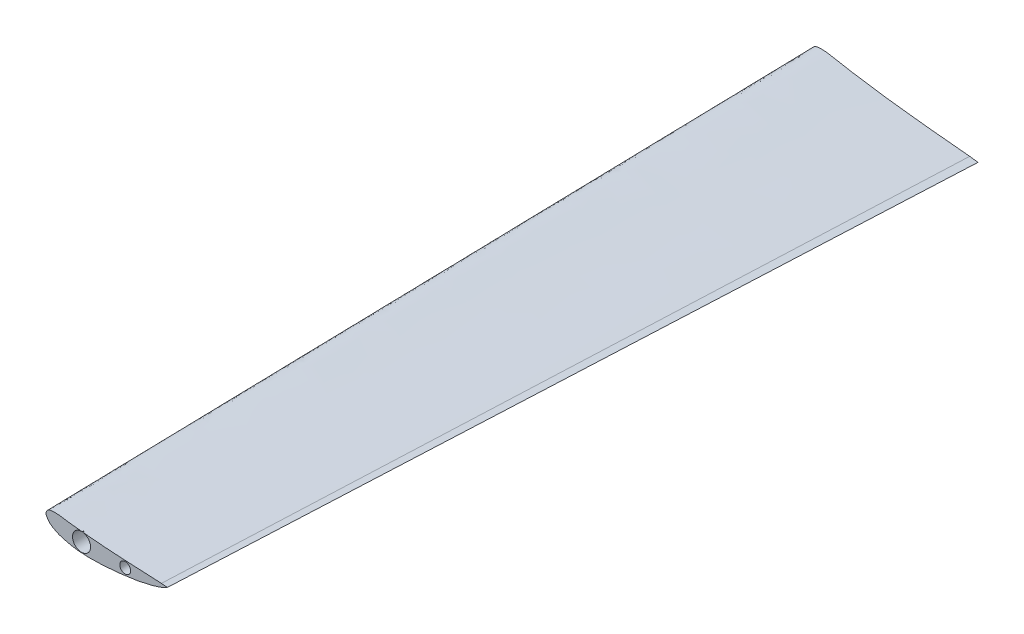
ISO-10303-21;
HEADER;
FILE_DESCRIPTION(('STEP AP214'),'2;1');
FILE_NAME('part.step','',(''),(''),'','','');
FILE_SCHEMA(('AUTOMOTIVE_DESIGN { 1 0 10303 214 1 1 1 1 }'));
ENDSEC;
DATA;
#1=APPLICATION_CONTEXT('core data for automotive mechanical design processes');
#2=APPLICATION_PROTOCOL_DEFINITION('international standard','automotive_design',2000,#1);
#3=PRODUCT_CONTEXT('',#1,'mechanical');
#4=PRODUCT('Part','Part','',(#3));
#5=PRODUCT_RELATED_PRODUCT_CATEGORY('part','',(#4));
#6=PRODUCT_DEFINITION_FORMATION('','',#4);
#7=PRODUCT_DEFINITION_CONTEXT('part definition',#1,'design');
#8=PRODUCT_DEFINITION('design','',#6,#7);
#9=PRODUCT_DEFINITION_SHAPE('','',#8);
#10=(LENGTH_UNIT() NAMED_UNIT(*) SI_UNIT(.MILLI.,.METRE.));
#11=(NAMED_UNIT(*) PLANE_ANGLE_UNIT() SI_UNIT($,.RADIAN.));
#12=(NAMED_UNIT(*) SI_UNIT($,.STERADIAN.) SOLID_ANGLE_UNIT());
#13=UNCERTAINTY_MEASURE_WITH_UNIT(LENGTH_MEASURE(1.E-05),#10,'distance_accuracy_value','');
#14=(GEOMETRIC_REPRESENTATION_CONTEXT(3) GLOBAL_UNCERTAINTY_ASSIGNED_CONTEXT((#13)) GLOBAL_UNIT_ASSIGNED_CONTEXT((#10,
#11,#12)) REPRESENTATION_CONTEXT('',''));
#15=CARTESIAN_POINT('',(0.,0.,0.));
#16=DIRECTION('',(0.,0.,1.));
#17=DIRECTION('',(1.,0.,0.));
#18=AXIS2_PLACEMENT_3D('',#15,#16,#17);
#19=CARTESIAN_POINT('',(-12.5819997362755,1.44490278911865,-215.));
#20=DIRECTION('',(0.,0.,1.));
#21=DIRECTION('',(1.,0.,0.));
#22=AXIS2_PLACEMENT_3D('',#19,#20,#21);
#23=PLANE('',#22);
#24=CARTESIAN_POINT('',(12.063322186895,-0.172116284613179,-215.));
#25=DIRECTION('',(0.,0.,1.));
#26=DIRECTION('',(1.,0.,0.));
#27=AXIS2_PLACEMENT_3D('',#24,#25,#26);
#28=CIRCLE('',#27,1.5);
#29=CARTESIAN_POINT('',(13.563322186895,-0.172116284613179,-215.));
#30=VERTEX_POINT('',#29);
#31=EDGE_CURVE('E121',#30,#30,#28,.T.);
#32=ORIENTED_EDGE('',*,*,#31,.T.);
#33=EDGE_LOOP('',(#32));
#34=FACE_BOUND('',#33,.T.);
#35=CARTESIAN_POINT('',(0.,0.,-215.));
#36=DIRECTION('',(0.,0.,1.));
#37=DIRECTION('',(1.,0.,0.));
#38=AXIS2_PLACEMENT_3D('',#35,#36,#37);
#39=CIRCLE('',#38,2.5);
#40=CARTESIAN_POINT('',(2.5,0.,-215.));
#41=VERTEX_POINT('',#40);
#42=EDGE_CURVE('E84',#41,#41,#39,.T.);
#43=ORIENTED_EDGE('',*,*,#42,.T.);
#44=EDGE_LOOP('',(#43));
#45=FACE_BOUND('',#44,.T.);
#46=CARTESIAN_POINT('',(30.4113785621477,-0.0484002442627476,-215.));
#47=CARTESIAN_POINT('',(29.6454694877873,0.026566871565662,-215.));
#48=CARTESIAN_POINT('',(27.3477422647068,0.251468219050302,-215.));
#49=CARTESIAN_POINT('',(23.5189856354564,0.633666696272388,-215.));
#50=CARTESIAN_POINT('',(18.9212057833677,1.05691563565401,-215.));
#51=CARTESIAN_POINT('',(14.3378164362077,1.60965355839776,-215.));
#52=CARTESIAN_POINT('',(9.74673995821571,2.09062433500616,-215.));
#53=CARTESIAN_POINT('',(5.17509493438157,2.72885063741591,-215.));
#54=CARTESIAN_POINT('',(0.60167993974661,3.36062908634859,-215.));
#55=CARTESIAN_POINT('',(-3.19166320344617,4.00741358924806,-215.));
#56=CARTESIAN_POINT('',(-6.23140034199928,4.5128685145492,-215.));
#57=CARTESIAN_POINT('',(-8.10480601021255,4.97070206772562,-215.));
#58=CARTESIAN_POINT('',(-9.6435286668681,5.134562868883,-215.));
#59=CARTESIAN_POINT('',(-10.8052865093902,5.16710523802775,-215.));
#60=CARTESIAN_POINT('',(-11.8533241938368,5.1160194218416,-215.));
#61=CARTESIAN_POINT('',(-12.8545459614183,4.57851263632639,-215.));
#62=CARTESIAN_POINT('',(-13.6239443974408,3.4061895897156,-215.));
#63=CARTESIAN_POINT('',(-13.0093761995299,2.17115138802204,-215.));
#64=CARTESIAN_POINT('',(-12.3983110532503,1.08953086614345,-215.));
#65=CARTESIAN_POINT('',(-11.4952204988513,0.229604254835794,-215.));
#66=CARTESIAN_POINT('',(-10.3842737514795,-0.511205932124786,-215.));
#67=CARTESIAN_POINT('',(-8.96546395144117,-1.35652737302625,-215.));
#68=CARTESIAN_POINT('',(-7.09095487017499,-2.06430188624797,-215.));
#69=CARTESIAN_POINT('',(-4.12337213787246,-3.02777084468667,-215.));
#70=CARTESIAN_POINT('',(-0.300492468612642,-3.68923892534138,-215.));
#71=CARTESIAN_POINT('',(4.31749802810697,-4.06348304674317,-215.));
#72=CARTESIAN_POINT('',(8.96994319746569,-4.06972331148482,-215.));
#73=CARTESIAN_POINT('',(13.6447489370111,-3.89627252679786,-215.));
#74=CARTESIAN_POINT('',(18.3482661610054,-3.5773782916158,-215.));
#75=CARTESIAN_POINT('',(23.0987876160855,-3.04952608629674,-215.));
#76=CARTESIAN_POINT('',(27.0628881136656,-2.27096966882288,-215.));
#77=CARTESIAN_POINT('',(30.3218247503512,-1.45813343814418,-215.));
#78=CARTESIAN_POINT('',(31.8897041320066,-0.722475780532528,-215.));
#79=CARTESIAN_POINT('',(32.7002748517004,-0.34215152602974,-215.));
#80=B_SPLINE_CURVE_WITH_KNOTS('',3,(#46,#47,#48,#49,#50,#51,#52,#53,#54,#55,#56,#57,#58,#59,#60,
#61,#62,#63,#64,#65,#66,#67,#68,#69,#70,#71,#72,#73,#74,#75,#76,#77,#78,#79),.UNSPECIFIED.,.F.,
.F.,(4,1,1,1,1,1,1,1,1,1,1,1,1,1,1,1,1,1,1,1,1,1,1,1,1,1,1,1,1,1,1,4),(0.,0.024539223239315,
0.0736176697179449,0.122696116196575,0.171758102468826,0.220820088741077,0.269879113320182,
0.318936693489756,0.368025361597795,0.392583028094628,0.417173001250673,0.429440472758663,
0.441764658743505,0.454461371263475,0.461994015532278,0.477712656864197,0.492780517083889,
0.502278122505289,0.517831839222446,0.531656069899839,0.544957030128068,0.57036121074101,
0.595284183630096,0.644429948946362,0.693535769444944,0.742943262592495,0.792666042354747,
0.842690657547491,0.893260265870848,0.94491578158227,0.971522264346957,1.),.UNSPECIFIED.);
#81=CARTESIAN_POINT('',(30.4113785621477,-0.0484002442627476,-215.));
#82=VERTEX_POINT('',#81);
#83=CARTESIAN_POINT('',(32.7002748517004,-0.34215152602974,-215.));
#84=VERTEX_POINT('',#83);
#85=EDGE_CURVE('E72',#82,#84,#80,.T.);
#86=ORIENTED_EDGE('',*,*,#85,.F.);
#87=DIRECTION('',(-0.991865092818963,0.127293509839388,0.));
#88=VECTOR('',#87,1.);
#89=CARTESIAN_POINT('',(32.7002748517004,-0.34215152602974,-215.));
#90=LINE('',#89,#88);
#91=EDGE_CURVE('E80',#84,#82,#90,.T.);
#92=ORIENTED_EDGE('',*,*,#91,.F.);
#93=EDGE_LOOP('',(#86,#92));
#94=FACE_BOUND('',#93,.T.);
#95=ADVANCED_FACE('F32',(#34,#45,#94),#23,.F.);
#96=CARTESIAN_POINT('',(-9.1846178220403,0.580425458073898,0.));
#97=DIRECTION('',(0.,0.,1.));
#98=DIRECTION('',(1.,0.,0.));
#99=AXIS2_PLACEMENT_3D('',#96,#97,#98);
#100=PLANE('',#99);
#101=CARTESIAN_POINT('',(12.063322186895,-0.172116284613179,0.));
#102=DIRECTION('',(0.,0.,1.));
#103=DIRECTION('',(1.,0.,0.));
#104=AXIS2_PLACEMENT_3D('',#101,#102,#103);
#105=CIRCLE('',#104,1.5);
#106=CARTESIAN_POINT('',(13.563322186895,-0.172116284613179,0.));
#107=VERTEX_POINT('',#106);
#108=EDGE_CURVE('E120',#107,#107,#105,.T.);
#109=ORIENTED_EDGE('',*,*,#108,.F.);
#110=EDGE_LOOP('',(#109));
#111=FACE_BOUND('',#110,.T.);
#112=CARTESIAN_POINT('',(0.,0.,0.));
#113=DIRECTION('',(0.,0.,1.));
#114=DIRECTION('',(1.,0.,0.));
#115=AXIS2_PLACEMENT_3D('',#112,#113,#114);
#116=CIRCLE('',#115,2.5);
#117=CARTESIAN_POINT('',(0.153121299110419,2.49530636751457,0.));
#118=VERTEX_POINT('',#117);
#119=CARTESIAN_POINT('',(0.357507457151753,2.47430564362628,0.));
#120=VERTEX_POINT('',#119);
#121=EDGE_CURVE('E47',#118,#120,#116,.T.);
#122=ORIENTED_EDGE('',*,*,#121,.F.);
#123=CARTESIAN_POINT('',(22.0715765829593,1.0964239984999,0.));
#124=CARTESIAN_POINT('',(21.5129609855841,1.12233023010941,0.));
#125=CARTESIAN_POINT('',(19.8371141934561,1.20004892493016,0.));
#126=CARTESIAN_POINT('',(17.0443346440732,1.33495274337798,0.));
#127=CARTESIAN_POINT('',(13.6919415082813,1.47103334069017,0.));
#128=CARTESIAN_POINT('',(10.3451736406459,1.70162055059243,0.));
#129=CARTESIAN_POINT('',(6.99549747831452,1.8798397570044,0.));
#130=CARTESIAN_POINT('',(3.65407170127752,2.17290353735083,0.));
#131=CARTESIAN_POINT('',(0.311601354683333,2.46122220272871,0.));
#132=CARTESIAN_POINT('',(-2.46532308344138,2.7894558402592,0.));
#133=CARTESIAN_POINT('',(-4.69009113974561,3.04316571433984,0.));
#134=CARTESIAN_POINT('',(-6.06667141061634,3.30571331830383,0.));
#135=CARTESIAN_POINT('',(-7.18943144152673,3.36737549876843,0.));
#136=CARTESIAN_POINT('',(-8.03373904894833,3.34776499409811,0.));
#137=CARTESIAN_POINT('',(-8.79240740399156,3.27169616669253,0.));
#138=CARTESIAN_POINT('',(-9.49900230014999,2.84436976011835,0.));
#139=CARTESIAN_POINT('',(-10.0137409058902,1.96497791565589,0.));
#140=CARTESIAN_POINT('',(-9.52179057235325,1.09156790701346,0.));
#141=CARTESIAN_POINT('',(-9.03809080525642,0.329363968913622,0.));
#142=CARTESIAN_POINT('',(-8.35071471199777,-0.261089261996217,0.));
#143=CARTESIAN_POINT('',(-7.51692784210611,-0.757364844497541,0.));
#144=CARTESIAN_POINT('',(-6.45583368158587,-1.31803007553604,0.));
#145=CARTESIAN_POINT('',(-5.06915283667242,-1.76192073669107,0.));
#146=CARTESIAN_POINT('',(-2.87970598414122,-2.35069970882986,0.));
#147=CARTESIAN_POINT('',(-0.0808003101623322,-2.68849033692148,0.));
#148=CARTESIAN_POINT('',(3.28443647452414,-2.78825575495709,0.));
#149=CARTESIAN_POINT('',(6.66098457506903,-2.61967589925133,0.));
#150=CARTESIAN_POINT('',(10.0470739610332,-2.31986084759109,0.));
#151=CARTESIAN_POINT('',(13.4485878274138,-1.91342804565213,0.));
#152=CARTESIAN_POINT('',(16.8764381116312,-1.35360387123978,0.));
#153=CARTESIAN_POINT('',(19.7242483275278,-0.641102884879055,0.));
#154=CARTESIAN_POINT('',(22.0590401190539,0.0700374504016294,0.));
#155=CARTESIAN_POINT('',(23.1694900758557,0.662247728612743,0.));
#156=CARTESIAN_POINT('',(23.74357647,0.968411785,0.));
#157=B_SPLINE_CURVE_WITH_KNOTS('',3,(#123,#124,#125,#126,#127,#128,#129,#130,#131,#132,#133,
#134,#135,#136,#137,#138,#139,#140,#141,#142,#143,#144,#145,#146,#147,#148,#149,#150,#151,#152,
#153,#154,#155,#156),.UNSPECIFIED.,.F.,.F.,(4,1,1,1,1,1,1,1,1,1,1,1,1,1,1,1,1,1,1,1,1,1,1,1,1,1,
1,1,1,1,1,4),(0.,0.024539223239315,0.0736176697179449,0.122696116196575,0.171758102468826,
0.220820088741077,0.269879113320182,0.318936693489756,0.368025361597795,0.392583028094628,
0.417173001250673,0.429440472758663,0.441764658743505,0.454461371263475,0.461994015532278,
0.477712656864197,0.492780517083889,0.502278122505289,0.517831839222446,0.531656069899839,
0.544957030128068,0.57036121074101,0.595284183630096,0.644429948946362,0.693535769444944,
0.742943262592495,0.792666042354747,0.842690657547491,0.893260265870848,0.94491578158227,
0.971522264346957,1.),.UNSPECIFIED.);
#158=CARTESIAN_POINT('',(23.74357647,0.968411785,0.));
#159=VERTEX_POINT('',#158);
#160=EDGE_CURVE('E35',#118,#159,#157,.T.);
#161=ORIENTED_EDGE('',*,*,#160,.T.);
#162=DIRECTION('',(-0.997081927121504,0.0763389193509316,0.));
#163=VECTOR('',#162,1.);
#164=CARTESIAN_POINT('',(22.0715765829593,1.0964239984999,0.));
#165=LINE('',#164,#163);
#166=CARTESIAN_POINT('',(22.0715765829593,1.0964239984999,0.));
#167=VERTEX_POINT('',#166);
#168=EDGE_CURVE('E41',#159,#167,#165,.T.);
#169=ORIENTED_EDGE('',*,*,#168,.T.);
#170=EDGE_CURVE('E75',#167,#120,#157,.T.);
#171=ORIENTED_EDGE('',*,*,#170,.T.);
#172=EDGE_LOOP('',(#122,#161,#169,#171));
#173=FACE_BOUND('',#172,.T.);
#174=ADVANCED_FACE('F110',(#111,#173),#100,.T.);
#175=CARTESIAN_POINT('',(23.74357647,0.968411785,0.));
#176=CARTESIAN_POINT('',(32.7002748517004,-0.34215152602974,-215.));
#177=CARTESIAN_POINT('',(23.1694900758557,0.662247728612743,0.));
#178=CARTESIAN_POINT('',(31.8897041320066,-0.722475780532528,-215.));
#179=CARTESIAN_POINT('',(22.0590401190539,0.0700374504016294,0.));
#180=CARTESIAN_POINT('',(30.3218247503512,-1.45813343814418,-215.));
#181=CARTESIAN_POINT('',(19.7242483275278,-0.641102884879055,0.));
#182=CARTESIAN_POINT('',(27.0628881136656,-2.27096966882288,-215.));
#183=CARTESIAN_POINT('',(16.8764381116312,-1.35360387123978,0.));
#184=CARTESIAN_POINT('',(23.0987876160855,-3.04952608629674,-215.));
#185=CARTESIAN_POINT('',(13.4485878274138,-1.91342804565213,0.));
#186=CARTESIAN_POINT('',(18.3482661610054,-3.5773782916158,-215.));
#187=CARTESIAN_POINT('',(10.0470739610332,-2.31986084759109,0.));
#188=CARTESIAN_POINT('',(13.6447489370111,-3.89627252679786,-215.));
#189=CARTESIAN_POINT('',(6.66098457506903,-2.61967589925133,0.));
#190=CARTESIAN_POINT('',(8.96994319746569,-4.06972331148482,-215.));
#191=CARTESIAN_POINT('',(3.28443647452414,-2.78825575495709,0.));
#192=CARTESIAN_POINT('',(4.31749802810697,-4.06348304674317,-215.));
#193=CARTESIAN_POINT('',(-0.0808003101623322,-2.68849033692148,0.));
#194=CARTESIAN_POINT('',(-0.300492468612642,-3.68923892534138,-215.));
#195=CARTESIAN_POINT('',(-2.87970598414122,-2.35069970882986,0.));
#196=CARTESIAN_POINT('',(-4.12337213787246,-3.02777084468667,-215.));
#197=CARTESIAN_POINT('',(-5.06915283667242,-1.76192073669107,0.));
#198=CARTESIAN_POINT('',(-7.09095487017499,-2.06430188624797,-215.));
#199=CARTESIAN_POINT('',(-6.45583368158587,-1.31803007553604,0.));
#200=CARTESIAN_POINT('',(-8.96546395144117,-1.35652737302625,-215.));
#201=CARTESIAN_POINT('',(-7.51692784210611,-0.757364844497541,0.));
#202=CARTESIAN_POINT('',(-10.3842737514795,-0.511205932124786,-215.));
#203=CARTESIAN_POINT('',(-8.35071471199777,-0.261089261996217,0.));
#204=CARTESIAN_POINT('',(-11.4952204988513,0.229604254835794,-215.));
#205=CARTESIAN_POINT('',(-9.03809080525642,0.329363968913622,0.));
#206=CARTESIAN_POINT('',(-12.3983110532503,1.08953086614345,-215.));
#207=CARTESIAN_POINT('',(-9.52179057235325,1.09156790701346,0.));
#208=CARTESIAN_POINT('',(-13.0093761995299,2.17115138802204,-215.));
#209=CARTESIAN_POINT('',(-10.0137409058902,1.96497791565589,0.));
#210=CARTESIAN_POINT('',(-13.6239443974408,3.4061895897156,-215.));
#211=CARTESIAN_POINT('',(-9.49900230014999,2.84436976011835,0.));
#212=CARTESIAN_POINT('',(-12.8545459614183,4.57851263632639,-215.));
#213=CARTESIAN_POINT('',(-8.79240740399156,3.27169616669253,0.));
#214=CARTESIAN_POINT('',(-11.8533241938368,5.1160194218416,-215.));
#215=CARTESIAN_POINT('',(-8.03373904894833,3.34776499409811,0.));
#216=CARTESIAN_POINT('',(-10.8052865093902,5.16710523802775,-215.));
#217=CARTESIAN_POINT('',(-7.18943144152673,3.36737549876843,0.));
#218=CARTESIAN_POINT('',(-9.6435286668681,5.134562868883,-215.));
#219=CARTESIAN_POINT('',(-6.06667141061634,3.30571331830383,0.));
#220=CARTESIAN_POINT('',(-8.10480601021255,4.97070206772562,-215.));
#221=CARTESIAN_POINT('',(-4.69009113974561,3.04316571433984,0.));
#222=CARTESIAN_POINT('',(-6.23140034199928,4.5128685145492,-215.));
#223=CARTESIAN_POINT('',(-2.46532308344138,2.7894558402592,0.));
#224=CARTESIAN_POINT('',(-3.19166320344617,4.00741358924806,-215.));
#225=CARTESIAN_POINT('',(0.311601354683333,2.46122220272871,0.));
#226=CARTESIAN_POINT('',(0.60167993974661,3.36062908634859,-215.));
#227=CARTESIAN_POINT('',(3.65407170127752,2.17290353735083,0.));
#228=CARTESIAN_POINT('',(5.17509493438157,2.72885063741591,-215.));
#229=CARTESIAN_POINT('',(6.99549747831452,1.8798397570044,0.));
#230=CARTESIAN_POINT('',(9.74673995821571,2.09062433500616,-215.));
#231=CARTESIAN_POINT('',(10.3451736406459,1.70162055059243,0.));
#232=CARTESIAN_POINT('',(14.3378164362077,1.60965355839776,-215.));
#233=CARTESIAN_POINT('',(13.6919415082813,1.47103334069017,0.));
#234=CARTESIAN_POINT('',(18.9212057833677,1.05691563565401,-215.));
#235=CARTESIAN_POINT('',(17.0443346440732,1.33495274337798,0.));
#236=CARTESIAN_POINT('',(23.5189856354564,0.633666696272388,-215.));
#237=CARTESIAN_POINT('',(19.8371141934561,1.20004892493016,0.));
#238=CARTESIAN_POINT('',(27.3477422647068,0.251468219050302,-215.));
#239=CARTESIAN_POINT('',(21.5129609855841,1.12233023010941,0.));
#240=CARTESIAN_POINT('',(29.6454694877873,0.026566871565662,-215.));
#241=CARTESIAN_POINT('',(22.0715765829593,1.0964239984999,0.));
#242=CARTESIAN_POINT('',(30.4113785621477,-0.0484002442627476,-215.));
#243=B_SPLINE_SURFACE_WITH_KNOTS('',3,1,((#175,#176),(#177,#178),(#179,#180),(#181,#182),(#183,
#184),(#185,#186),(#187,#188),(#189,#190),(#191,#192),(#193,#194),(#195,#196),(#197,#198),(#199,
#200),(#201,#202),(#203,#204),(#205,#206),(#207,#208),(#209,#210),(#211,#212),(#213,#214),(#215,
#216),(#217,#218),(#219,#220),(#221,#222),(#223,#224),(#225,#226),(#227,#228),(#229,#230),(#231,
#232),(#233,#234),(#235,#236),(#237,#238),(#239,#240),(#241,#242)),.UNSPECIFIED.,.F.,.F.,.F.,(4,
1,1,1,1,1,1,1,1,1,1,1,1,1,1,1,1,1,1,1,1,1,1,1,1,1,1,1,1,1,1,4),(2,2),(0.,0.0284777356530428,
0.05508421841773,0.106739734129152,0.157309342452509,0.207333957645253,0.257056737407505,
0.306464230555056,0.355570051053638,0.404715816369904,0.42963878925899,0.455042969871932,
0.468343930100161,0.482168160777554,0.497721877494711,0.507219482916111,0.522287343135803,
0.538005984467722,0.545538628736525,0.558235341256495,0.570559527241337,0.582826998749327,
0.607416971905372,0.631974638402205,0.681063306510244,0.730120886679818,0.779179911258923,
0.828241897531174,0.877303883803425,0.926382330282055,0.975460776760685,1.),(0.,1.),.UNSPECIFIED.);
#244=CARTESIAN_POINT('',(0.357507457143472,2.4743056436273,0.));
#245=CARTESIAN_POINT('',(0.354458926469496,2.47474558186586,-0.0298885510122569));
#246=CARTESIAN_POINT('',(0.351296196098467,2.47519729973913,-0.0597675951842414));
#247=CARTESIAN_POINT('',(0.344592633455489,2.47613976601038,-0.119517389221041));
#248=CARTESIAN_POINT('',(0.341051367145189,2.47663055904478,-0.149388089322852));
#249=CARTESIAN_POINT('',(0.333470768747803,2.47766251784021,-0.208879278295173));
#250=CARTESIAN_POINT('',(0.329434628878436,2.4782033557486,-0.238500177222233));
#251=CARTESIAN_POINT('',(0.320562348200661,2.4793670097308,-0.297610543184939));
#252=CARTESIAN_POINT('',(0.315726662898253,2.47998977908672,-0.327100075293581));
#253=CARTESIAN_POINT('',(0.307256866314618,2.48104840520576,-0.371123046602125));
#254=CARTESIAN_POINT('',(0.304228715804162,2.48142228659477,-0.385770837971462));
#255=CARTESIAN_POINT('',(0.29914310353819,2.48203874131099,-0.407660237814664));
#256=CARTESIAN_POINT('',(0.297351586589957,2.48225417592656,-0.414963191174693));
#257=CARTESIAN_POINT('',(0.293508359161257,2.48271153639381,-0.429496348392756));
#258=CARTESIAN_POINT('',(0.291456739595537,2.4829534529851,-0.436726576722134));
#259=CARTESIAN_POINT('',(0.28694205080004,2.48347935564413,-0.451116128597556));
#260=CARTESIAN_POINT('',(0.284476482594086,2.48376359596104,-0.45827472339559));
#261=CARTESIAN_POINT('',(0.280198456128209,2.4842485322065,-0.468752721406425));
#262=CARTESIAN_POINT('',(0.278680714891849,2.48441939980637,-0.472193115378916));
#263=CARTESIAN_POINT('',(0.275332418956917,2.48479275585812,-0.478937222835612));
#264=CARTESIAN_POINT('',(0.273501332539547,2.4849952980077,-0.482240691934881));
#265=CARTESIAN_POINT('',(0.270316627594046,2.48534304204117,-0.486923133745054));
#266=CARTESIAN_POINT('',(0.269175580546354,2.4854669720023,-0.48844504142325));
#267=CARTESIAN_POINT('',(0.266680127266485,2.48573596703582,-0.491295158468583));
#268=CARTESIAN_POINT('',(0.265327300326838,2.48588087511123,-0.492624671561263));
#269=CARTESIAN_POINT('',(0.262668732980793,2.4861630022986,-0.494617230550495));
#270=CARTESIAN_POINT('',(0.261429248546364,2.48629375766042,-0.495363630901056));
#271=CARTESIAN_POINT('',(0.25873942147023,2.48657508770333,-0.496415519372753));
#272=CARTESIAN_POINT('',(0.257287160883219,2.4867258413339,-0.49671668662441));
#273=CARTESIAN_POINT('',(0.25456119469602,2.4870062869608,-0.49669083021597));
#274=CARTESIAN_POINT('',(0.253286644793345,2.48713636479072,-0.496433752894143));
#275=CARTESIAN_POINT('',(0.250474466528956,2.48742139817708,-0.495405692356242));
#276=CARTESIAN_POINT('',(0.248995721292104,2.4875696707108,-0.494489144701747));
#277=CARTESIAN_POINT('',(0.245124455400893,2.48795510734928,-0.491451831907146));
#278=CARTESIAN_POINT('',(0.243044235482672,2.48815860040407,-0.488974343185505));
#279=CARTESIAN_POINT('',(0.239192837033677,2.48853180485781,-0.483559842165578));
#280=CARTESIAN_POINT('',(0.237455340670816,2.48869796198339,-0.480602481342675));
#281=CARTESIAN_POINT('',(0.234266351246269,2.48900016519811,-0.474531780786315));
#282=CARTESIAN_POINT('',(0.232815059305275,2.48913619012106,-0.471418333281453));
#283=CARTESIAN_POINT('',(0.228712330764933,2.48951769216537,-0.461911229322966));
#284=CARTESIAN_POINT('',(0.226340708071472,2.48973385936505,-0.455400595182327));
#285=CARTESIAN_POINT('',(0.219860819239005,2.49031721436532,-0.435924193119294));
#286=CARTESIAN_POINT('',(0.216283884533033,2.4906289606254,-0.42278924295895));
#287=CARTESIAN_POINT('',(0.209770717617125,2.49118571614992,-0.396349263191182));
#288=CARTESIAN_POINT('',(0.206835581918245,2.49143061137419,-0.383043982989267));
#289=CARTESIAN_POINT('',(0.201384456875727,2.49187716553206,-0.356423598136296));
#290=CARTESIAN_POINT('',(0.198866241285687,2.49207905587683,-0.343108953941505));
#291=CARTESIAN_POINT('',(0.194101858567968,2.49245463070234,-0.316442915594048));
#292=CARTESIAN_POINT('',(0.191855474347339,2.49262833772943,-0.303091559593801));
#293=CARTESIAN_POINT('',(0.185847759901557,2.49308558841455,-0.265701296987039));
#294=CARTESIAN_POINT('',(0.18230625009182,2.49334630662057,-0.241626898325031));
#295=CARTESIAN_POINT('',(0.175632272594833,2.4938252378344,-0.193412166180002));
#296=CARTESIAN_POINT('',(0.172499979247636,2.49404343274518,-0.169271809038852));
#297=CARTESIAN_POINT('',(0.166530632555012,2.49444914961712,-0.120950030759928));
#298=CARTESIAN_POINT('',(0.163693634542494,2.49463666583339,-0.0967686027858926));
#299=CARTESIAN_POINT('',(0.158251035476813,2.49498773183012,-0.0483940549504102));
#300=CARTESIAN_POINT('',(0.155645297327296,2.4951512958479,-0.0242009506810057));
#301=CARTESIAN_POINT('',(0.153121299107264,2.49530636751489,0.));
#302=B_SPLINE_CURVE_WITH_KNOTS('',3,(#244,#245,#246,#247,#248,#249,#250,#251,#252,#253,#254,
#255,#256,#257,#258,#259,#260,#261,#262,#263,#264,#265,#266,#267,#268,#269,#270,#271,#272,#273,
#274,#275,#276,#277,#278,#279,#280,#281,#282,#283,#284,#285,#286,#287,#288,#289,#290,#291,#292,
#293,#294,#295,#296,#297,#298,#299,#300,#301),.UNSPECIFIED.,.F.,.F.,(4,2,2,2,2,2,2,2,2,2,2,2,2,
2,2,2,2,2,2,2,2,2,2,2,2,2,2,2,4),(0.,0.090144026561878,0.180392546263611,0.270086841812274,
0.359730212927786,0.404605556486446,0.427169127536853,0.449724833481098,0.472421954456464,
0.483709626385709,0.495016645947525,0.500724522505288,0.506391701051853,0.510702206274158,
0.515054275302986,0.518892696573438,0.524042466454418,0.533635121227056,0.54392861351063,
0.554229313630119,0.575001742055047,0.615809892846074,0.656687228686516,0.697338710942178,
0.737957510346076,0.810955565793032,0.883984620162559,0.957027334290652,1.0300264536114),.UNSPECIFIED.);
#303=EDGE_CURVE('E11',#120,#118,#302,.T.);
#304=DIRECTION('',(0.0387600784270214,-0.00532068717523119,-0.999234380217331));
#305=VECTOR('',#304,1.);
#306=CARTESIAN_POINT('',(26.2414775725535,0.524011877118575,-107.5));
#307=LINE('',#306,#305);
#308=EDGE_CURVE('E68',#167,#82,#307,.T.);
#309=DIRECTION('',(-0.0416221881144613,0.00609024780593711,0.999114859432201));
#310=VECTOR('',#309,1.);
#311=CARTESIAN_POINT('',(28.2219256608502,0.31313012948513,-107.5));
#312=LINE('',#311,#310);
#313=EDGE_CURVE('E78',#84,#159,#312,.T.);
#314=ORIENTED_EDGE('',*,*,#303,.F.);
#315=ORIENTED_EDGE('',*,*,#170,.F.);
#316=ORIENTED_EDGE('',*,*,#308,.T.);
#317=ORIENTED_EDGE('',*,*,#85,.T.);
#318=ORIENTED_EDGE('',*,*,#313,.T.);
#319=ORIENTED_EDGE('',*,*,#160,.F.);
#320=EDGE_LOOP('',(#314,#315,#316,#317,#318,#319));
#321=FACE_BOUND('',#320,.T.);
#322=ADVANCED_FACE('F70',(#321),#243,.T.);
#323=CARTESIAN_POINT('',(22.0715765829593,1.0964239984999,0.));
#324=CARTESIAN_POINT('',(30.4113785621477,-0.0484002442627475,-215.));
#325=CARTESIAN_POINT('',(22.3502432307995,1.07508862958325,0.));
#326=CARTESIAN_POINT('',(30.7928612770732,-0.0973587912239162,-215.));
#327=CARTESIAN_POINT('',(22.6289098786396,1.0537532606666,0.));
#328=CARTESIAN_POINT('',(31.1743439919987,-0.146317338185083,-215.));
#329=CARTESIAN_POINT('',(23.1862431743198,1.0110825228333,0.));
#330=CARTESIAN_POINT('',(31.9373094218495,-0.244234432107414,-215.));
#331=CARTESIAN_POINT('',(23.4649098221599,0.989747153916648,0.));
#332=CARTESIAN_POINT('',(32.318792136775,-0.293192979068578,-215.));
#333=CARTESIAN_POINT('',(23.74357647,0.968411785,0.));
#334=CARTESIAN_POINT('',(32.7002748517004,-0.34215152602974,-215.));
#335=B_SPLINE_SURFACE_WITH_KNOTS('',3,1,((#323,#324),(#325,#326),(#327,#328),(#329,#330),(#331,
#332),(#333,#334)),.UNSPECIFIED.,.F.,.F.,.F.,(4,2,4),(2,2),(0.,0.5,1.),(0.,1.),.UNSPECIFIED.);
#336=ORIENTED_EDGE('',*,*,#168,.F.);
#337=ORIENTED_EDGE('',*,*,#313,.F.);
#338=ORIENTED_EDGE('',*,*,#91,.T.);
#339=ORIENTED_EDGE('',*,*,#308,.F.);
#340=EDGE_LOOP('',(#336,#337,#338,#339));
#341=FACE_BOUND('',#340,.T.);
#342=ADVANCED_FACE('F81',(#341),#335,.T.);
#343=CARTESIAN_POINT('',(0.,0.,-215.));
#344=DIRECTION('',(0.,0.,1.));
#345=DIRECTION('',(1.,0.,0.));
#346=AXIS2_PLACEMENT_3D('',#343,#344,#345);
#347=CYLINDRICAL_SURFACE('',#346,2.5);
#348=ORIENTED_EDGE('',*,*,#303,.T.);
#349=ORIENTED_EDGE('',*,*,#121,.T.);
#350=EDGE_LOOP('',(#348,#349));
#351=FACE_BOUND('',#350,.T.);
#352=ORIENTED_EDGE('',*,*,#42,.F.);
#353=EDGE_LOOP('',(#352));
#354=FACE_BOUND('',#353,.T.);
#355=ADVANCED_FACE('F105',(#351,#354),#347,.F.);
#356=CARTESIAN_POINT('',(12.063322186895,-0.172116284613179,-215.));
#357=DIRECTION('',(0.,0.,1.));
#358=DIRECTION('',(1.,0.,0.));
#359=AXIS2_PLACEMENT_3D('',#356,#357,#358);
#360=CYLINDRICAL_SURFACE('',#359,1.5);
#361=CARTESIAN_POINT('',(13.563322186895,-0.172116284613179,-215.));
#362=CARTESIAN_POINT('',(13.563322186895,-0.172116284613179,-212.760416666667));
#363=CARTESIAN_POINT('',(13.563322186895,-0.172116284613179,-210.520833333333));
#364=CARTESIAN_POINT('',(13.563322186895,-0.172116284613179,-206.041666666667));
#365=CARTESIAN_POINT('',(13.563322186895,-0.172116284613179,-203.802083333333));
#366=CARTESIAN_POINT('',(13.563322186895,-0.172116284613179,-199.322916666667));
#367=CARTESIAN_POINT('',(13.563322186895,-0.172116284613179,-197.083333333333));
#368=CARTESIAN_POINT('',(13.563322186895,-0.172116284613179,-192.604166666667));
#369=CARTESIAN_POINT('',(13.563322186895,-0.172116284613179,-190.364583333333));
#370=CARTESIAN_POINT('',(13.563322186895,-0.172116284613179,-185.885416666667));
#371=CARTESIAN_POINT('',(13.563322186895,-0.172116284613179,-183.645833333333));
#372=CARTESIAN_POINT('',(13.563322186895,-0.172116284613179,-179.166666666667));
#373=CARTESIAN_POINT('',(13.563322186895,-0.172116284613179,-176.927083333333));
#374=CARTESIAN_POINT('',(13.563322186895,-0.172116284613179,-172.447916666667));
#375=CARTESIAN_POINT('',(13.563322186895,-0.172116284613179,-170.208333333333));
#376=CARTESIAN_POINT('',(13.563322186895,-0.172116284613179,-165.729166666667));
#377=CARTESIAN_POINT('',(13.563322186895,-0.172116284613179,-163.489583333333));
#378=CARTESIAN_POINT('',(13.563322186895,-0.172116284613179,-159.010416666667));
#379=CARTESIAN_POINT('',(13.563322186895,-0.172116284613179,-156.770833333333));
#380=CARTESIAN_POINT('',(13.563322186895,-0.172116284613179,-152.291666666667));
#381=CARTESIAN_POINT('',(13.563322186895,-0.172116284613179,-150.052083333333));
#382=CARTESIAN_POINT('',(13.563322186895,-0.172116284613179,-145.572916666667));
#383=CARTESIAN_POINT('',(13.563322186895,-0.172116284613179,-143.333333333333));
#384=CARTESIAN_POINT('',(13.563322186895,-0.172116284613179,-138.854166666667));
#385=CARTESIAN_POINT('',(13.563322186895,-0.172116284613179,-136.614583333333));
#386=CARTESIAN_POINT('',(13.563322186895,-0.172116284613179,-132.135416666667));
#387=CARTESIAN_POINT('',(13.563322186895,-0.172116284613179,-129.895833333333));
#388=CARTESIAN_POINT('',(13.563322186895,-0.172116284613179,-125.416666666667));
#389=CARTESIAN_POINT('',(13.563322186895,-0.172116284613179,-123.177083333333));
#390=CARTESIAN_POINT('',(13.563322186895,-0.172116284613179,-118.697916666667));
#391=CARTESIAN_POINT('',(13.563322186895,-0.172116284613179,-116.458333333333));
#392=CARTESIAN_POINT('',(13.563322186895,-0.172116284613179,-111.979166666667));
#393=CARTESIAN_POINT('',(13.563322186895,-0.172116284613179,-109.739583333333));
#394=CARTESIAN_POINT('',(13.563322186895,-0.172116284613179,-105.260416666667));
#395=CARTESIAN_POINT('',(13.563322186895,-0.172116284613179,-103.020833333333));
#396=CARTESIAN_POINT('',(13.563322186895,-0.172116284613179,-98.5416666666667));
#397=CARTESIAN_POINT('',(13.563322186895,-0.172116284613179,-96.3020833333333));
#398=CARTESIAN_POINT('',(13.563322186895,-0.172116284613179,-91.8229166666667));
#399=CARTESIAN_POINT('',(13.563322186895,-0.172116284613179,-89.5833333333333));
#400=CARTESIAN_POINT('',(13.563322186895,-0.172116284613179,-85.1041666666667));
#401=CARTESIAN_POINT('',(13.563322186895,-0.172116284613179,-82.8645833333334));
#402=CARTESIAN_POINT('',(13.563322186895,-0.172116284613179,-78.3854166666667));
#403=CARTESIAN_POINT('',(13.563322186895,-0.172116284613179,-76.1458333333334));
#404=CARTESIAN_POINT('',(13.563322186895,-0.172116284613179,-71.6666666666667));
#405=CARTESIAN_POINT('',(13.563322186895,-0.172116284613179,-69.4270833333334));
#406=CARTESIAN_POINT('',(13.563322186895,-0.172116284613179,-64.9479166666667));
#407=CARTESIAN_POINT('',(13.563322186895,-0.172116284613179,-62.7083333333333));
#408=CARTESIAN_POINT('',(13.563322186895,-0.172116284613179,-58.2291666666667));
#409=CARTESIAN_POINT('',(13.563322186895,-0.172116284613179,-55.9895833333333));
#410=CARTESIAN_POINT('',(13.563322186895,-0.172116284613179,-51.5104166666667));
#411=CARTESIAN_POINT('',(13.563322186895,-0.172116284613179,-49.2708333333334));
#412=CARTESIAN_POINT('',(13.563322186895,-0.172116284613179,-44.7916666666667));
#413=CARTESIAN_POINT('',(13.563322186895,-0.172116284613179,-42.5520833333334));
#414=CARTESIAN_POINT('',(13.563322186895,-0.172116284613179,-38.0729166666667));
#415=CARTESIAN_POINT('',(13.563322186895,-0.172116284613179,-35.8333333333334));
#416=CARTESIAN_POINT('',(13.563322186895,-0.172116284613179,-31.3541666666667));
#417=CARTESIAN_POINT('',(13.563322186895,-0.172116284613179,-29.1145833333334));
#418=CARTESIAN_POINT('',(13.563322186895,-0.172116284613179,-24.6354166666667));
#419=CARTESIAN_POINT('',(13.563322186895,-0.172116284613179,-22.3958333333334));
#420=CARTESIAN_POINT('',(13.563322186895,-0.172116284613179,-17.9166666666667));
#421=CARTESIAN_POINT('',(13.563322186895,-0.172116284613179,-15.6770833333333));
#422=CARTESIAN_POINT('',(13.563322186895,-0.172116284613179,-11.1979166666667));
#423=CARTESIAN_POINT('',(13.563322186895,-0.172116284613179,-8.95833333333336));
#424=CARTESIAN_POINT('',(13.563322186895,-0.172116284613179,-4.47916666666669));
#425=CARTESIAN_POINT('',(13.563322186895,-0.172116284613179,-2.23958333333336));
#426=CARTESIAN_POINT('',(13.563322186895,-0.172116284613179,0.));
#427=B_SPLINE_CURVE_WITH_KNOTS('',3,(#361,#362,#363,#364,#365,#366,#367,#368,#369,#370,#371,
#372,#373,#374,#375,#376,#377,#378,#379,#380,#381,#382,#383,#384,#385,#386,#387,#388,#389,#390,
#391,#392,#393,#394,#395,#396,#397,#398,#399,#400,#401,#402,#403,#404,#405,#406,#407,#408,#409,
#410,#411,#412,#413,#414,#415,#416,#417,#418,#419,#420,#421,#422,#423,#424,#425,#426),
.UNSPECIFIED.,.F.,.F.,(4,2,2,2,2,2,2,2,2,2,2,2,2,2,2,2,2,2,2,2,2,2,2,2,2,2,2,2,2,2,2,2,4),(0.,
6.71875000000002,13.4375,20.15625,26.875,33.59375,40.3125,47.03125,53.75,60.46875,67.1875,
73.90625,80.625,87.34375,94.0625,100.78125,107.5,114.21875,120.9375,127.65625,134.375,141.09375,
147.8125,154.53125,161.25,167.96875,174.6875,181.40625,188.125,194.84375,201.5625,208.28125,
215.),.UNSPECIFIED.);
#428=EDGE_CURVE('BSEAM109',#30,#107,#427,.T.);
#429=ORIENTED_EDGE('',*,*,#31,.F.);
#430=ORIENTED_EDGE('',*,*,#108,.T.);
#431=ORIENTED_EDGE('',*,*,#428,.T.);
#432=ORIENTED_EDGE('',*,*,#428,.F.);
#433=EDGE_LOOP('',(#429,#431,#430,#432));
#434=FACE_BOUND('',#433,.T.);
#435=ADVANCED_FACE('F109',(#434),#360,.F.);
#436=CLOSED_SHELL('',(#95,#174,#322,#342,#355,#435));
#437=MANIFOLD_SOLID_BREP('B2',#436);
#438=ADVANCED_BREP_SHAPE_REPRESENTATION('',(#18,#437),#14);
#439=SHAPE_DEFINITION_REPRESENTATION(#9,#438);
ENDSEC;
END-ISO-10303-21;
